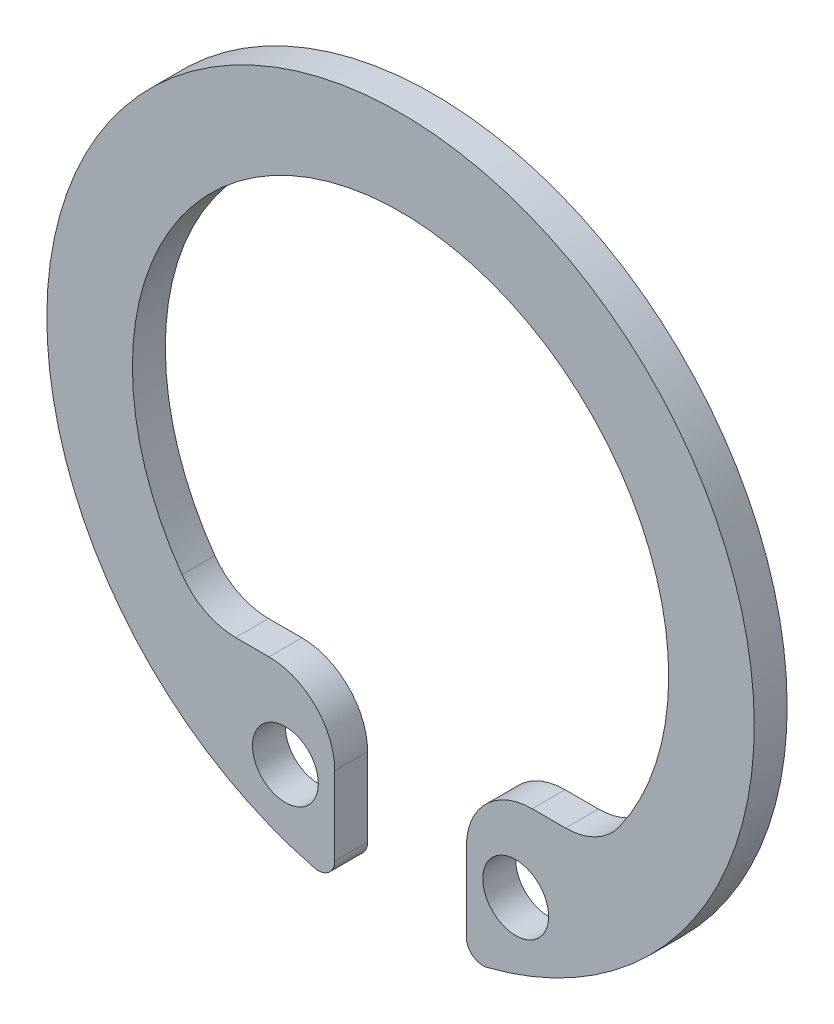
ISO-10303-21;
HEADER;
FILE_DESCRIPTION(('STEP AP214'),'2;1');
FILE_NAME('part.step','',(''),(''),'','','');
FILE_SCHEMA(('AUTOMOTIVE_DESIGN { 1 0 10303 214 1 1 1 1 }'));
ENDSEC;
DATA;
#1=APPLICATION_CONTEXT('core data for automotive mechanical design processes');
#2=APPLICATION_PROTOCOL_DEFINITION('international standard','automotive_design',2000,#1);
#3=PRODUCT_CONTEXT('',#1,'mechanical');
#4=PRODUCT('Part','Part','',(#3));
#5=PRODUCT_RELATED_PRODUCT_CATEGORY('part','',(#4));
#6=PRODUCT_DEFINITION_FORMATION('','',#4);
#7=PRODUCT_DEFINITION_CONTEXT('part definition',#1,'design');
#8=PRODUCT_DEFINITION('design','',#6,#7);
#9=PRODUCT_DEFINITION_SHAPE('','',#8);
#10=(LENGTH_UNIT() NAMED_UNIT(*) SI_UNIT(.MILLI.,.METRE.));
#11=(NAMED_UNIT(*) PLANE_ANGLE_UNIT() SI_UNIT($,.RADIAN.));
#12=(NAMED_UNIT(*) SI_UNIT($,.STERADIAN.) SOLID_ANGLE_UNIT());
#13=UNCERTAINTY_MEASURE_WITH_UNIT(LENGTH_MEASURE(1.E-05),#10,'distance_accuracy_value','');
#14=(GEOMETRIC_REPRESENTATION_CONTEXT(3) GLOBAL_UNCERTAINTY_ASSIGNED_CONTEXT((#13)) GLOBAL_UNIT_ASSIGNED_CONTEXT((#10,
#11,#12)) REPRESENTATION_CONTEXT('',''));
#15=CARTESIAN_POINT('',(0.,0.,0.));
#16=DIRECTION('',(0.,0.,1.));
#17=DIRECTION('',(1.,0.,0.));
#18=AXIS2_PLACEMENT_3D('',#15,#16,#17);
#19=CARTESIAN_POINT('',(0.,0.,1.));
#20=DIRECTION('',(0.,0.,1.));
#21=DIRECTION('',(1.,0.,0.));
#22=AXIS2_PLACEMENT_3D('',#19,#20,#21);
#23=PLANE('',#22);
#24=CARTESIAN_POINT('',(-3.5,-8.15,1.));
#25=DIRECTION('',(0.,0.,1.));
#26=DIRECTION('',(1.,0.,0.));
#27=AXIS2_PLACEMENT_3D('',#24,#25,#26);
#28=CIRCLE('',#27,1.);
#29=CARTESIAN_POINT('',(-2.5,-8.15,1.));
#30=VERTEX_POINT('',#29);
#31=EDGE_CURVE('E232',#30,#30,#28,.T.);
#32=ORIENTED_EDGE('',*,*,#31,.F.);
#33=EDGE_LOOP('',(#32));
#34=FACE_BOUND('',#33,.T.);
#35=DIRECTION('',(0.,-1.,0.));
#36=VECTOR('',#35,1.);
#37=CARTESIAN_POINT('',(2.,-5.5623150871388,1.));
#38=LINE('',#37,#36);
#39=CARTESIAN_POINT('',(2.,-7.5623150871388,1.));
#40=VERTEX_POINT('',#39);
#41=CARTESIAN_POINT('',(2.,-9.94044767603552,1.));
#42=VERTEX_POINT('',#41);
#43=EDGE_CURVE('E211',#40,#42,#38,.T.);
#44=ORIENTED_EDGE('',*,*,#43,.T.);
#45=CARTESIAN_POINT('',(2.5,-9.94044767603552,1.));
#46=DIRECTION('',(0.,0.,1.));
#47=DIRECTION('',(1.,0.,0.));
#48=AXIS2_PLACEMENT_3D('',#45,#46,#47);
#49=CIRCLE('',#48,0.5);
#50=CARTESIAN_POINT('',(2.6219512195122,-10.4253475626714,1.));
#51=VERTEX_POINT('',#50);
#52=EDGE_CURVE('E42',#42,#51,#49,.T.);
#53=ORIENTED_EDGE('',*,*,#52,.T.);
#54=CARTESIAN_POINT('',(0.,0.,1.));
#55=DIRECTION('',(0.,0.,1.));
#56=DIRECTION('',(1.,0.,0.));
#57=AXIS2_PLACEMENT_3D('',#54,#55,#56);
#58=CIRCLE('',#57,10.75);
#59=CARTESIAN_POINT('',(-2.62195121951219,-10.4253475626714,1.));
#60=VERTEX_POINT('',#59);
#61=EDGE_CURVE('E210',#51,#60,#58,.T.);
#62=ORIENTED_EDGE('',*,*,#61,.T.);
#63=CARTESIAN_POINT('',(-2.5,-9.94044767603552,1.));
#64=DIRECTION('',(0.,0.,1.));
#65=DIRECTION('',(1.,0.,0.));
#66=AXIS2_PLACEMENT_3D('',#63,#64,#65);
#67=CIRCLE('',#66,0.5);
#68=CARTESIAN_POINT('',(-2.,-9.94044767603552,1.));
#69=VERTEX_POINT('',#68);
#70=EDGE_CURVE('E49',#60,#69,#67,.T.);
#71=ORIENTED_EDGE('',*,*,#70,.T.);
#72=DIRECTION('',(0.,1.,0.));
#73=VECTOR('',#72,1.);
#74=CARTESIAN_POINT('',(-2.,-5.5623150871388,1.));
#75=LINE('',#74,#73);
#76=CARTESIAN_POINT('',(-2.,-7.5623150871388,1.));
#77=VERTEX_POINT('',#76);
#78=EDGE_CURVE('E169',#69,#77,#75,.T.);
#79=ORIENTED_EDGE('',*,*,#78,.T.);
#80=CARTESIAN_POINT('',(-4.,-7.5623150871388,1.));
#81=DIRECTION('',(0.,0.,1.));
#82=DIRECTION('',(1.,0.,0.));
#83=AXIS2_PLACEMENT_3D('',#80,#81,#82);
#84=CIRCLE('',#83,2.);
#85=CARTESIAN_POINT('',(-4.,-5.5623150871388,1.));
#86=VERTEX_POINT('',#85);
#87=EDGE_CURVE('E186',#77,#86,#84,.T.);
#88=ORIENTED_EDGE('',*,*,#87,.T.);
#89=DIRECTION('',(-1.,0.,0.));
#90=VECTOR('',#89,1.);
#91=CARTESIAN_POINT('',(-2.,-5.5623150871388,1.));
#92=LINE('',#91,#90);
#93=CARTESIAN_POINT('',(-5.01322363554064,-5.5623150871388,1.));
#94=VERTEX_POINT('',#93);
#95=EDGE_CURVE('E168',#86,#94,#92,.T.);
#96=ORIENTED_EDGE('',*,*,#95,.T.);
#97=CARTESIAN_POINT('',(-5.01322363554064,-3.5623150871388,1.));
#98=DIRECTION('',(0.,0.,1.));
#99=DIRECTION('',(1.,0.,0.));
#100=AXIS2_PLACEMENT_3D('',#97,#98,#99);
#101=CIRCLE('',#100,2.);
#102=CARTESIAN_POINT('',(-6.64354026498475,-4.72079153824085,1.));
#103=VERTEX_POINT('',#102);
#104=EDGE_CURVE('E195',#94,#103,#101,.F.);
#105=ORIENTED_EDGE('',*,*,#104,.T.);
#106=CARTESIAN_POINT('',(0.,0.,1.));
#107=DIRECTION('',(0.,0.,-1.));
#108=DIRECTION('',(1.,0.,0.));
#109=AXIS2_PLACEMENT_3D('',#106,#107,#108);
#110=CIRCLE('',#109,8.15);
#111=CARTESIAN_POINT('',(6.64354026498475,-4.72079153824085,1.));
#112=VERTEX_POINT('',#111);
#113=EDGE_CURVE('E225',#103,#112,#110,.T.);
#114=ORIENTED_EDGE('',*,*,#113,.T.);
#115=CARTESIAN_POINT('',(5.01322363554064,-3.5623150871388,1.));
#116=DIRECTION('',(0.,0.,1.));
#117=DIRECTION('',(1.,0.,0.));
#118=AXIS2_PLACEMENT_3D('',#115,#116,#117);
#119=CIRCLE('',#118,2.);
#120=CARTESIAN_POINT('',(5.01322363554064,-5.5623150871388,1.));
#121=VERTEX_POINT('',#120);
#122=EDGE_CURVE('E136',#112,#121,#119,.F.);
#123=ORIENTED_EDGE('',*,*,#122,.T.);
#124=DIRECTION('',(-1.,0.,0.));
#125=VECTOR('',#124,1.);
#126=CARTESIAN_POINT('',(2.,-5.5623150871388,1.));
#127=LINE('',#126,#125);
#128=CARTESIAN_POINT('',(4.,-5.5623150871388,1.));
#129=VERTEX_POINT('',#128);
#130=EDGE_CURVE('E146',#121,#129,#127,.T.);
#131=ORIENTED_EDGE('',*,*,#130,.T.);
#132=CARTESIAN_POINT('',(4.,-7.5623150871388,1.));
#133=DIRECTION('',(0.,0.,1.));
#134=DIRECTION('',(1.,0.,0.));
#135=AXIS2_PLACEMENT_3D('',#132,#133,#134);
#136=CIRCLE('',#135,2.);
#137=EDGE_CURVE('E188',#129,#40,#136,.T.);
#138=ORIENTED_EDGE('',*,*,#137,.T.);
#139=EDGE_LOOP('',(#44,#53,#62,#71,#79,#88,#96,#105,#114,#123,#131,#138));
#140=FACE_BOUND('',#139,.T.);
#141=CARTESIAN_POINT('',(3.5,-8.15,1.));
#142=DIRECTION('',(0.,0.,1.));
#143=DIRECTION('',(1.,0.,0.));
#144=AXIS2_PLACEMENT_3D('',#141,#142,#143);
#145=CIRCLE('',#144,0.999999999999998);
#146=CARTESIAN_POINT('',(4.5,-8.15,1.));
#147=VERTEX_POINT('',#146);
#148=EDGE_CURVE('E242',#147,#147,#145,.T.);
#149=ORIENTED_EDGE('',*,*,#148,.F.);
#150=EDGE_LOOP('',(#149));
#151=FACE_BOUND('',#150,.T.);
#152=ADVANCED_FACE('F34',(#34,#140,#151),#23,.T.);
#153=CARTESIAN_POINT('',(0.,0.,0.));
#154=DIRECTION('',(0.,0.,1.));
#155=DIRECTION('',(1.,0.,0.));
#156=AXIS2_PLACEMENT_3D('',#153,#154,#155);
#157=PLANE('',#156);
#158=CARTESIAN_POINT('',(0.,0.,0.));
#159=DIRECTION('',(0.,0.,1.));
#160=DIRECTION('',(1.,0.,0.));
#161=AXIS2_PLACEMENT_3D('',#158,#159,#160);
#162=CIRCLE('',#161,10.75);
#163=CARTESIAN_POINT('',(2.6219512195122,-10.4253475626714,0.));
#164=VERTEX_POINT('',#163);
#165=CARTESIAN_POINT('',(-2.62195121951219,-10.4253475626714,0.));
#166=VERTEX_POINT('',#165);
#167=EDGE_CURVE('E158',#164,#166,#162,.T.);
#168=ORIENTED_EDGE('',*,*,#167,.F.);
#169=CARTESIAN_POINT('',(2.5,-9.94044767603552,0.));
#170=DIRECTION('',(0.,0.,1.));
#171=DIRECTION('',(1.,0.,0.));
#172=AXIS2_PLACEMENT_3D('',#169,#170,#171);
#173=CIRCLE('',#172,0.5);
#174=CARTESIAN_POINT('',(2.,-9.94044767603552,0.));
#175=VERTEX_POINT('',#174);
#176=EDGE_CURVE('E204',#164,#175,#173,.F.);
#177=ORIENTED_EDGE('',*,*,#176,.T.);
#178=DIRECTION('',(0.,-1.,0.));
#179=VECTOR('',#178,1.);
#180=CARTESIAN_POINT('',(2.,-5.5623150871388,0.));
#181=LINE('',#180,#179);
#182=CARTESIAN_POINT('',(2.,-7.5623150871388,0.));
#183=VERTEX_POINT('',#182);
#184=EDGE_CURVE('E155',#183,#175,#181,.T.);
#185=ORIENTED_EDGE('',*,*,#184,.F.);
#186=CARTESIAN_POINT('',(4.,-7.5623150871388,0.));
#187=DIRECTION('',(0.,0.,1.));
#188=DIRECTION('',(1.,0.,0.));
#189=AXIS2_PLACEMENT_3D('',#186,#187,#188);
#190=CIRCLE('',#189,2.);
#191=CARTESIAN_POINT('',(4.,-5.5623150871388,0.));
#192=VERTEX_POINT('',#191);
#193=EDGE_CURVE('E154',#183,#192,#190,.F.);
#194=ORIENTED_EDGE('',*,*,#193,.T.);
#195=DIRECTION('',(-1.,0.,0.));
#196=VECTOR('',#195,1.);
#197=CARTESIAN_POINT('',(2.,-5.5623150871388,0.));
#198=LINE('',#197,#196);
#199=CARTESIAN_POINT('',(5.01322363554064,-5.5623150871388,0.));
#200=VERTEX_POINT('',#199);
#201=EDGE_CURVE('E143',#200,#192,#198,.T.);
#202=ORIENTED_EDGE('',*,*,#201,.F.);
#203=CARTESIAN_POINT('',(5.01322363554064,-3.5623150871388,0.));
#204=DIRECTION('',(0.,0.,1.));
#205=DIRECTION('',(1.,0.,0.));
#206=AXIS2_PLACEMENT_3D('',#203,#204,#205);
#207=CIRCLE('',#206,2.);
#208=CARTESIAN_POINT('',(6.64354026498475,-4.72079153824085,0.));
#209=VERTEX_POINT('',#208);
#210=EDGE_CURVE('E126',#200,#209,#207,.T.);
#211=ORIENTED_EDGE('',*,*,#210,.T.);
#212=CARTESIAN_POINT('',(0.,0.,0.));
#213=DIRECTION('',(0.,0.,-1.));
#214=DIRECTION('',(1.,0.,0.));
#215=AXIS2_PLACEMENT_3D('',#212,#213,#214);
#216=CIRCLE('',#215,8.15);
#217=CARTESIAN_POINT('',(-6.64354026498475,-4.72079153824085,0.));
#218=VERTEX_POINT('',#217);
#219=EDGE_CURVE('E156',#218,#209,#216,.T.);
#220=ORIENTED_EDGE('',*,*,#219,.F.);
#221=CARTESIAN_POINT('',(-5.01322363554064,-3.5623150871388,0.));
#222=DIRECTION('',(0.,0.,1.));
#223=DIRECTION('',(1.,0.,0.));
#224=AXIS2_PLACEMENT_3D('',#221,#222,#223);
#225=CIRCLE('',#224,2.);
#226=CARTESIAN_POINT('',(-5.01322363554064,-5.5623150871388,0.));
#227=VERTEX_POINT('',#226);
#228=EDGE_CURVE('E193',#218,#227,#225,.T.);
#229=ORIENTED_EDGE('',*,*,#228,.T.);
#230=DIRECTION('',(-1.,0.,0.));
#231=VECTOR('',#230,1.);
#232=CARTESIAN_POINT('',(-2.,-5.5623150871388,0.));
#233=LINE('',#232,#231);
#234=CARTESIAN_POINT('',(-4.,-5.5623150871388,0.));
#235=VERTEX_POINT('',#234);
#236=EDGE_CURVE('E160',#235,#227,#233,.T.);
#237=ORIENTED_EDGE('',*,*,#236,.F.);
#238=CARTESIAN_POINT('',(-4.,-7.5623150871388,0.));
#239=DIRECTION('',(0.,0.,1.));
#240=DIRECTION('',(1.,0.,0.));
#241=AXIS2_PLACEMENT_3D('',#238,#239,#240);
#242=CIRCLE('',#241,2.);
#243=CARTESIAN_POINT('',(-2.,-7.5623150871388,0.));
#244=VERTEX_POINT('',#243);
#245=EDGE_CURVE('E182',#235,#244,#242,.F.);
#246=ORIENTED_EDGE('',*,*,#245,.T.);
#247=DIRECTION('',(0.,1.,0.));
#248=VECTOR('',#247,1.);
#249=CARTESIAN_POINT('',(-2.,-5.5623150871388,0.));
#250=LINE('',#249,#248);
#251=CARTESIAN_POINT('',(-2.,-9.94044767603552,0.));
#252=VERTEX_POINT('',#251);
#253=EDGE_CURVE('E166',#252,#244,#250,.T.);
#254=ORIENTED_EDGE('',*,*,#253,.F.);
#255=CARTESIAN_POINT('',(-2.5,-9.94044767603552,0.));
#256=DIRECTION('',(0.,0.,1.));
#257=DIRECTION('',(1.,0.,0.));
#258=AXIS2_PLACEMENT_3D('',#255,#256,#257);
#259=CIRCLE('',#258,0.5);
#260=EDGE_CURVE('E202',#252,#166,#259,.F.);
#261=ORIENTED_EDGE('',*,*,#260,.T.);
#262=EDGE_LOOP('',(#168,#177,#185,#194,#202,#211,#220,#229,#237,#246,#254,#261));
#263=FACE_BOUND('',#262,.T.);
#264=CARTESIAN_POINT('',(-3.5,-8.15,0.));
#265=DIRECTION('',(0.,0.,1.));
#266=DIRECTION('',(1.,0.,0.));
#267=AXIS2_PLACEMENT_3D('',#264,#265,#266);
#268=CIRCLE('',#267,1.);
#269=CARTESIAN_POINT('',(-2.5,-8.15,0.));
#270=VERTEX_POINT('',#269);
#271=EDGE_CURVE('E237',#270,#270,#268,.T.);
#272=ORIENTED_EDGE('',*,*,#271,.T.);
#273=EDGE_LOOP('',(#272));
#274=FACE_BOUND('',#273,.T.);
#275=CARTESIAN_POINT('',(3.5,-8.15,0.));
#276=DIRECTION('',(0.,0.,1.));
#277=DIRECTION('',(1.,0.,0.));
#278=AXIS2_PLACEMENT_3D('',#275,#276,#277);
#279=CIRCLE('',#278,0.999999999999998);
#280=CARTESIAN_POINT('',(4.5,-8.15,0.));
#281=VERTEX_POINT('',#280);
#282=EDGE_CURVE('E245',#281,#281,#279,.T.);
#283=ORIENTED_EDGE('',*,*,#282,.T.);
#284=EDGE_LOOP('',(#283));
#285=FACE_BOUND('',#284,.T.);
#286=ADVANCED_FACE('F151',(#263,#274,#285),#157,.F.);
#287=CARTESIAN_POINT('',(-2.,-5.5623150871388,1.));
#288=DIRECTION('',(0.,-1.,0.));
#289=DIRECTION('',(1.,0.,0.));
#290=AXIS2_PLACEMENT_3D('',#287,#288,#289);
#291=PLANE('',#290);
#292=ORIENTED_EDGE('',*,*,#236,.T.);
#293=DIRECTION('',(0.,0.,1.));
#294=VECTOR('',#293,1.);
#295=CARTESIAN_POINT('',(-5.01322363554064,-5.5623150871388,1.));
#296=LINE('',#295,#294);
#297=EDGE_CURVE('E177',#227,#94,#296,.T.);
#298=ORIENTED_EDGE('',*,*,#297,.T.);
#299=ORIENTED_EDGE('',*,*,#95,.F.);
#300=DIRECTION('',(0.,0.,-1.));
#301=VECTOR('',#300,1.);
#302=CARTESIAN_POINT('',(-4.,-5.5623150871388,1.));
#303=LINE('',#302,#301);
#304=EDGE_CURVE('E174',#86,#235,#303,.T.);
#305=ORIENTED_EDGE('',*,*,#304,.T.);
#306=EDGE_LOOP('',(#292,#298,#299,#305));
#307=FACE_BOUND('',#306,.T.);
#308=ADVANCED_FACE('F276',(#307),#291,.F.);
#309=CARTESIAN_POINT('',(0.,0.,1.));
#310=DIRECTION('',(0.,0.,-1.));
#311=DIRECTION('',(-1.,0.,0.));
#312=AXIS2_PLACEMENT_3D('',#309,#310,#311);
#313=CYLINDRICAL_SURFACE('',#312,8.15);
#314=ORIENTED_EDGE('',*,*,#219,.T.);
#315=DIRECTION('',(0.,0.,-1.));
#316=VECTOR('',#315,1.);
#317=CARTESIAN_POINT('',(6.64354026498475,-4.72079153824085,1.));
#318=LINE('',#317,#316);
#319=EDGE_CURVE('E131',#209,#112,#318,.F.);
#320=ORIENTED_EDGE('',*,*,#319,.T.);
#321=ORIENTED_EDGE('',*,*,#113,.F.);
#322=DIRECTION('',(0.,0.,-1.));
#323=VECTOR('',#322,1.);
#324=CARTESIAN_POINT('',(-6.64354026498475,-4.72079153824085,1.));
#325=LINE('',#324,#323);
#326=EDGE_CURVE('E147',#103,#218,#325,.T.);
#327=ORIENTED_EDGE('',*,*,#326,.T.);
#328=EDGE_LOOP('',(#314,#320,#321,#327));
#329=FACE_BOUND('',#328,.T.);
#330=ADVANCED_FACE('F257',(#329),#313,.F.);
#331=CARTESIAN_POINT('',(2.,-5.5623150871388,1.));
#332=DIRECTION('',(0.,-1.,0.));
#333=DIRECTION('',(1.,0.,0.));
#334=AXIS2_PLACEMENT_3D('',#331,#332,#333);
#335=PLANE('',#334);
#336=ORIENTED_EDGE('',*,*,#130,.F.);
#337=DIRECTION('',(0.,0.,1.));
#338=VECTOR('',#337,1.);
#339=CARTESIAN_POINT('',(5.01322363554064,-5.5623150871388,0.));
#340=LINE('',#339,#338);
#341=EDGE_CURVE('E130',#121,#200,#340,.F.);
#342=ORIENTED_EDGE('',*,*,#341,.T.);
#343=ORIENTED_EDGE('',*,*,#201,.T.);
#344=DIRECTION('',(0.,0.,-1.));
#345=VECTOR('',#344,1.);
#346=CARTESIAN_POINT('',(4.,-5.5623150871388,1.));
#347=LINE('',#346,#345);
#348=EDGE_CURVE('E148',#192,#129,#347,.F.);
#349=ORIENTED_EDGE('',*,*,#348,.T.);
#350=EDGE_LOOP('',(#336,#342,#343,#349));
#351=FACE_BOUND('',#350,.T.);
#352=ADVANCED_FACE('F142',(#351),#335,.F.);
#353=CARTESIAN_POINT('',(2.,-5.5623150871388,1.));
#354=DIRECTION('',(1.,0.,0.));
#355=DIRECTION('',(0.,1.,0.));
#356=AXIS2_PLACEMENT_3D('',#353,#354,#355);
#357=PLANE('',#356);
#358=ORIENTED_EDGE('',*,*,#184,.T.);
#359=DIRECTION('',(0.,0.,-1.));
#360=VECTOR('',#359,1.);
#361=CARTESIAN_POINT('',(2.,-9.94044767603552,1.));
#362=LINE('',#361,#360);
#363=EDGE_CURVE('E57',#175,#42,#362,.F.);
#364=ORIENTED_EDGE('',*,*,#363,.T.);
#365=ORIENTED_EDGE('',*,*,#43,.F.);
#366=DIRECTION('',(0.,0.,-1.));
#367=VECTOR('',#366,1.);
#368=CARTESIAN_POINT('',(2.,-7.5623150871388,1.));
#369=LINE('',#368,#367);
#370=EDGE_CURVE('E179',#40,#183,#369,.T.);
#371=ORIENTED_EDGE('',*,*,#370,.T.);
#372=EDGE_LOOP('',(#358,#364,#365,#371));
#373=FACE_BOUND('',#372,.T.);
#374=ADVANCED_FACE('F219',(#373),#357,.F.);
#375=CARTESIAN_POINT('',(0.,0.,1.));
#376=DIRECTION('',(0.,0.,-1.));
#377=DIRECTION('',(-1.,0.,0.));
#378=AXIS2_PLACEMENT_3D('',#375,#376,#377);
#379=CYLINDRICAL_SURFACE('',#378,10.75);
#380=ORIENTED_EDGE('',*,*,#61,.F.);
#381=DIRECTION('',(0.,0.,-1.));
#382=VECTOR('',#381,1.);
#383=CARTESIAN_POINT('',(2.6219512195122,-10.4253475626714,1.));
#384=LINE('',#383,#382);
#385=EDGE_CURVE('E199',#51,#164,#384,.T.);
#386=ORIENTED_EDGE('',*,*,#385,.T.);
#387=ORIENTED_EDGE('',*,*,#167,.T.);
#388=DIRECTION('',(0.,0.,-1.));
#389=VECTOR('',#388,1.);
#390=CARTESIAN_POINT('',(-2.62195121951219,-10.4253475626714,1.));
#391=LINE('',#390,#389);
#392=EDGE_CURVE('E197',#166,#60,#391,.F.);
#393=ORIENTED_EDGE('',*,*,#392,.T.);
#394=EDGE_LOOP('',(#380,#386,#387,#393));
#395=FACE_BOUND('',#394,.T.);
#396=ADVANCED_FACE('F215',(#395),#379,.T.);
#397=CARTESIAN_POINT('',(-2.,-5.5623150871388,1.));
#398=DIRECTION('',(-1.,0.,0.));
#399=DIRECTION('',(0.,-1.,0.));
#400=AXIS2_PLACEMENT_3D('',#397,#398,#399);
#401=PLANE('',#400);
#402=ORIENTED_EDGE('',*,*,#78,.F.);
#403=DIRECTION('',(0.,0.,-1.));
#404=VECTOR('',#403,1.);
#405=CARTESIAN_POINT('',(-2.,-9.94044767603552,1.));
#406=LINE('',#405,#404);
#407=EDGE_CURVE('E11',#69,#252,#406,.T.);
#408=ORIENTED_EDGE('',*,*,#407,.T.);
#409=ORIENTED_EDGE('',*,*,#253,.T.);
#410=DIRECTION('',(0.,0.,-1.));
#411=VECTOR('',#410,1.);
#412=CARTESIAN_POINT('',(-2.,-7.5623150871388,1.));
#413=LINE('',#412,#411);
#414=EDGE_CURVE('E137',#244,#77,#413,.F.);
#415=ORIENTED_EDGE('',*,*,#414,.T.);
#416=EDGE_LOOP('',(#402,#408,#409,#415));
#417=FACE_BOUND('',#416,.T.);
#418=ADVANCED_FACE('F263',(#417),#401,.F.);
#419=CARTESIAN_POINT('',(-3.5,-8.15,1.));
#420=DIRECTION('',(0.,0.,-1.));
#421=DIRECTION('',(-1.,0.,0.));
#422=AXIS2_PLACEMENT_3D('',#419,#420,#421);
#423=CYLINDRICAL_SURFACE('',#422,1.);
#424=ORIENTED_EDGE('',*,*,#31,.T.);
#425=EDGE_LOOP('',(#424));
#426=FACE_BOUND('',#425,.T.);
#427=ORIENTED_EDGE('',*,*,#271,.F.);
#428=EDGE_LOOP('',(#427));
#429=FACE_BOUND('',#428,.T.);
#430=ADVANCED_FACE('F279',(#426,#429),#423,.F.);
#431=CARTESIAN_POINT('',(3.5,-8.15,1.));
#432=DIRECTION('',(0.,0.,-1.));
#433=DIRECTION('',(-1.,0.,0.));
#434=AXIS2_PLACEMENT_3D('',#431,#432,#433);
#435=CYLINDRICAL_SURFACE('',#434,0.999999999999998);
#436=ORIENTED_EDGE('',*,*,#148,.T.);
#437=EDGE_LOOP('',(#436));
#438=FACE_BOUND('',#437,.T.);
#439=ORIENTED_EDGE('',*,*,#282,.F.);
#440=EDGE_LOOP('',(#439));
#441=FACE_BOUND('',#440,.T.);
#442=ADVANCED_FACE('F296',(#438,#441),#435,.F.);
#443=CARTESIAN_POINT('',(5.01322363554064,-3.5623150871388,1.));
#444=DIRECTION('',(0.,0.,-1.));
#445=DIRECTION('',(-1.,0.,0.));
#446=AXIS2_PLACEMENT_3D('',#443,#444,#445);
#447=CYLINDRICAL_SURFACE('',#446,2.);
#448=ORIENTED_EDGE('',*,*,#122,.F.);
#449=ORIENTED_EDGE('',*,*,#319,.F.);
#450=ORIENTED_EDGE('',*,*,#210,.F.);
#451=ORIENTED_EDGE('',*,*,#341,.F.);
#452=EDGE_LOOP('',(#448,#449,#450,#451));
#453=FACE_BOUND('',#452,.T.);
#454=ADVANCED_FACE('F129',(#453),#447,.F.);
#455=CARTESIAN_POINT('',(-5.01322363554064,-3.5623150871388,1.));
#456=DIRECTION('',(0.,0.,-1.));
#457=DIRECTION('',(-1.,0.,0.));
#458=AXIS2_PLACEMENT_3D('',#455,#456,#457);
#459=CYLINDRICAL_SURFACE('',#458,2.);
#460=ORIENTED_EDGE('',*,*,#104,.F.);
#461=ORIENTED_EDGE('',*,*,#297,.F.);
#462=ORIENTED_EDGE('',*,*,#228,.F.);
#463=ORIENTED_EDGE('',*,*,#326,.F.);
#464=EDGE_LOOP('',(#460,#461,#462,#463));
#465=FACE_BOUND('',#464,.T.);
#466=ADVANCED_FACE('F255',(#465),#459,.F.);
#467=CARTESIAN_POINT('',(4.,-7.5623150871388,1.));
#468=DIRECTION('',(0.,0.,-1.));
#469=DIRECTION('',(-1.,0.,0.));
#470=AXIS2_PLACEMENT_3D('',#467,#468,#469);
#471=CYLINDRICAL_SURFACE('',#470,2.);
#472=ORIENTED_EDGE('',*,*,#137,.F.);
#473=ORIENTED_EDGE('',*,*,#348,.F.);
#474=ORIENTED_EDGE('',*,*,#193,.F.);
#475=ORIENTED_EDGE('',*,*,#370,.F.);
#476=EDGE_LOOP('',(#472,#473,#474,#475));
#477=FACE_BOUND('',#476,.T.);
#478=ADVANCED_FACE('F223',(#477),#471,.T.);
#479=CARTESIAN_POINT('',(-4.,-7.5623150871388,1.));
#480=DIRECTION('',(0.,0.,-1.));
#481=DIRECTION('',(-1.,0.,0.));
#482=AXIS2_PLACEMENT_3D('',#479,#480,#481);
#483=CYLINDRICAL_SURFACE('',#482,2.);
#484=ORIENTED_EDGE('',*,*,#87,.F.);
#485=ORIENTED_EDGE('',*,*,#414,.F.);
#486=ORIENTED_EDGE('',*,*,#245,.F.);
#487=ORIENTED_EDGE('',*,*,#304,.F.);
#488=EDGE_LOOP('',(#484,#485,#486,#487));
#489=FACE_BOUND('',#488,.T.);
#490=ADVANCED_FACE('F261',(#489),#483,.T.);
#491=CARTESIAN_POINT('',(2.5,-9.94044767603552,1.));
#492=DIRECTION('',(0.,0.,-1.));
#493=DIRECTION('',(-1.,0.,0.));
#494=AXIS2_PLACEMENT_3D('',#491,#492,#493);
#495=CYLINDRICAL_SURFACE('',#494,0.5);
#496=ORIENTED_EDGE('',*,*,#52,.F.);
#497=ORIENTED_EDGE('',*,*,#363,.F.);
#498=ORIENTED_EDGE('',*,*,#176,.F.);
#499=ORIENTED_EDGE('',*,*,#385,.F.);
#500=EDGE_LOOP('',(#496,#497,#498,#499));
#501=FACE_BOUND('',#500,.T.);
#502=ADVANCED_FACE('F218',(#501),#495,.T.);
#503=CARTESIAN_POINT('',(-2.5,-9.94044767603552,1.));
#504=DIRECTION('',(0.,0.,-1.));
#505=DIRECTION('',(-1.,0.,0.));
#506=AXIS2_PLACEMENT_3D('',#503,#504,#505);
#507=CYLINDRICAL_SURFACE('',#506,0.5);
#508=ORIENTED_EDGE('',*,*,#70,.F.);
#509=ORIENTED_EDGE('',*,*,#392,.F.);
#510=ORIENTED_EDGE('',*,*,#260,.F.);
#511=ORIENTED_EDGE('',*,*,#407,.F.);
#512=EDGE_LOOP('',(#508,#509,#510,#511));
#513=FACE_BOUND('',#512,.T.);
#514=ADVANCED_FACE('F36',(#513),#507,.T.);
#515=CLOSED_SHELL('',(#152,#286,#308,#330,#352,#374,#396,#418,#430,#442,#454,#466,#478,#490,
#502,#514));
#516=MANIFOLD_SOLID_BREP('B2',#515);
#517=ADVANCED_BREP_SHAPE_REPRESENTATION('',(#18,#516),#14);
#518=SHAPE_DEFINITION_REPRESENTATION(#9,#517);
ENDSEC;
END-ISO-10303-21;
